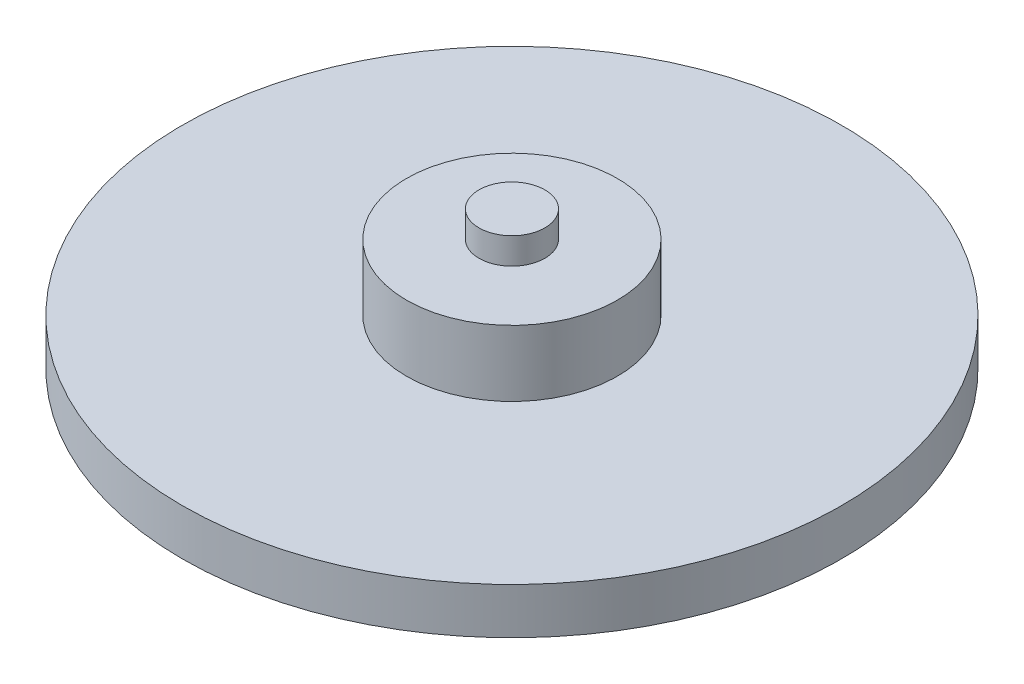
ISO-10303-21;
HEADER;
FILE_DESCRIPTION(('STEP AP214'),'2;1');
FILE_NAME('part.step','',(''),(''),'','','');
FILE_SCHEMA(('AUTOMOTIVE_DESIGN { 1 0 10303 214 1 1 1 1 }'));
ENDSEC;
DATA;
#1=APPLICATION_CONTEXT('core data for automotive mechanical design processes');
#2=APPLICATION_PROTOCOL_DEFINITION('international standard','automotive_design',2000,#1);
#3=PRODUCT_CONTEXT('',#1,'mechanical');
#4=PRODUCT('Part','Part','',(#3));
#5=PRODUCT_RELATED_PRODUCT_CATEGORY('part','',(#4));
#6=PRODUCT_DEFINITION_FORMATION('','',#4);
#7=PRODUCT_DEFINITION_CONTEXT('part definition',#1,'design');
#8=PRODUCT_DEFINITION('design','',#6,#7);
#9=PRODUCT_DEFINITION_SHAPE('','',#8);
#10=(LENGTH_UNIT() NAMED_UNIT(*) SI_UNIT(.MILLI.,.METRE.));
#11=(NAMED_UNIT(*) PLANE_ANGLE_UNIT() SI_UNIT($,.RADIAN.));
#12=(NAMED_UNIT(*) SI_UNIT($,.STERADIAN.) SOLID_ANGLE_UNIT());
#13=UNCERTAINTY_MEASURE_WITH_UNIT(LENGTH_MEASURE(1.E-05),#10,'distance_accuracy_value','');
#14=(GEOMETRIC_REPRESENTATION_CONTEXT(3) GLOBAL_UNCERTAINTY_ASSIGNED_CONTEXT((#13)) GLOBAL_UNIT_ASSIGNED_CONTEXT((#10,
#11,#12)) REPRESENTATION_CONTEXT('',''));
#15=CARTESIAN_POINT('',(0.,0.,0.));
#16=DIRECTION('',(0.,0.,1.));
#17=DIRECTION('',(1.,0.,0.));
#18=AXIS2_PLACEMENT_3D('',#15,#16,#17);
#19=CARTESIAN_POINT('',(0.,3.5,0.));
#20=DIRECTION('',(0.,-1.,0.));
#21=DIRECTION('',(0.,0.,-1.));
#22=AXIS2_PLACEMENT_3D('',#19,#20,#21);
#23=CYLINDRICAL_SURFACE('',#22,25.);
#24=CARTESIAN_POINT('',(0.,3.5,0.));
#25=DIRECTION('',(0.,1.,0.));
#26=DIRECTION('',(0.,0.,1.));
#27=AXIS2_PLACEMENT_3D('',#24,#25,#26);
#28=CIRCLE('',#27,25.);
#29=CARTESIAN_POINT('',(0.,3.5,25.));
#30=VERTEX_POINT('',#29);
#31=EDGE_CURVE('E51',#30,#30,#28,.T.);
#32=ORIENTED_EDGE('',*,*,#31,.F.);
#33=EDGE_LOOP('',(#32));
#34=FACE_BOUND('',#33,.T.);
#35=CARTESIAN_POINT('',(0.,0.,0.));
#36=DIRECTION('',(0.,1.,0.));
#37=DIRECTION('',(0.,0.,1.));
#38=AXIS2_PLACEMENT_3D('',#35,#36,#37);
#39=CIRCLE('',#38,25.);
#40=CARTESIAN_POINT('',(0.,0.,25.));
#41=VERTEX_POINT('',#40);
#42=EDGE_CURVE('E40',#41,#41,#39,.T.);
#43=ORIENTED_EDGE('',*,*,#42,.T.);
#44=EDGE_LOOP('',(#43));
#45=FACE_BOUND('',#44,.T.);
#46=ADVANCED_FACE('F37',(#34,#45),#23,.T.);
#47=CARTESIAN_POINT('',(0.,3.5,0.));
#48=DIRECTION('',(0.,1.,0.));
#49=DIRECTION('',(0.,0.,1.));
#50=AXIS2_PLACEMENT_3D('',#47,#48,#49);
#51=PLANE('',#50);
#52=CARTESIAN_POINT('',(0.,3.5,0.));
#53=DIRECTION('',(0.,1.,0.));
#54=DIRECTION('',(0.,0.,1.));
#55=AXIS2_PLACEMENT_3D('',#52,#53,#54);
#56=CIRCLE('',#55,8.);
#57=CARTESIAN_POINT('',(0.,3.5,8.));
#58=VERTEX_POINT('',#57);
#59=EDGE_CURVE('E45',#58,#58,#56,.T.);
#60=ORIENTED_EDGE('',*,*,#59,.F.);
#61=EDGE_LOOP('',(#60));
#62=FACE_BOUND('',#61,.T.);
#63=ORIENTED_EDGE('',*,*,#31,.T.);
#64=EDGE_LOOP('',(#63));
#65=FACE_BOUND('',#64,.T.);
#66=ADVANCED_FACE('F71',(#62,#65),#51,.T.);
#67=CARTESIAN_POINT('',(0.,0.,0.));
#68=DIRECTION('',(0.,1.,0.));
#69=DIRECTION('',(0.,0.,1.));
#70=AXIS2_PLACEMENT_3D('',#67,#68,#69);
#71=PLANE('',#70);
#72=ORIENTED_EDGE('',*,*,#42,.F.);
#73=EDGE_LOOP('',(#72));
#74=FACE_BOUND('',#73,.T.);
#75=ADVANCED_FACE('F68',(#74),#71,.F.);
#76=CARTESIAN_POINT('',(0.,8.5,0.));
#77=DIRECTION('',(0.,-1.,0.));
#78=DIRECTION('',(0.,0.,-1.));
#79=AXIS2_PLACEMENT_3D('',#76,#77,#78);
#80=CYLINDRICAL_SURFACE('',#79,8.);
#81=CARTESIAN_POINT('',(0.,8.5,0.));
#82=DIRECTION('',(0.,1.,0.));
#83=DIRECTION('',(0.,0.,1.));
#84=AXIS2_PLACEMENT_3D('',#81,#82,#83);
#85=CIRCLE('',#84,8.);
#86=CARTESIAN_POINT('',(0.,8.5,8.));
#87=VERTEX_POINT('',#86);
#88=EDGE_CURVE('E56',#87,#87,#85,.T.);
#89=ORIENTED_EDGE('',*,*,#88,.F.);
#90=EDGE_LOOP('',(#89));
#91=FACE_BOUND('',#90,.T.);
#92=ORIENTED_EDGE('',*,*,#59,.T.);
#93=EDGE_LOOP('',(#92));
#94=FACE_BOUND('',#93,.T.);
#95=ADVANCED_FACE('F70',(#91,#94),#80,.T.);
#96=CARTESIAN_POINT('',(0.,8.5,0.));
#97=DIRECTION('',(0.,1.,0.));
#98=DIRECTION('',(0.,0.,1.));
#99=AXIS2_PLACEMENT_3D('',#96,#97,#98);
#100=PLANE('',#99);
#101=CARTESIAN_POINT('',(0.,8.5,0.));
#102=DIRECTION('',(0.,1.,0.));
#103=DIRECTION('',(0.,0.,1.));
#104=AXIS2_PLACEMENT_3D('',#101,#102,#103);
#105=CIRCLE('',#104,2.5);
#106=CARTESIAN_POINT('',(0.,8.5,2.5));
#107=VERTEX_POINT('',#106);
#108=EDGE_CURVE('E10',#107,#107,#105,.T.);
#109=ORIENTED_EDGE('',*,*,#108,.F.);
#110=EDGE_LOOP('',(#109));
#111=FACE_BOUND('',#110,.T.);
#112=ORIENTED_EDGE('',*,*,#88,.T.);
#113=EDGE_LOOP('',(#112));
#114=FACE_BOUND('',#113,.T.);
#115=ADVANCED_FACE('F76',(#111,#114),#100,.T.);
#116=CARTESIAN_POINT('',(0.,10.5,0.));
#117=DIRECTION('',(0.,-1.,0.));
#118=DIRECTION('',(0.,0.,-1.));
#119=AXIS2_PLACEMENT_3D('',#116,#117,#118);
#120=CYLINDRICAL_SURFACE('',#119,2.5);
#121=CARTESIAN_POINT('',(0.,10.5,0.));
#122=DIRECTION('',(0.,1.,0.));
#123=DIRECTION('',(0.,0.,1.));
#124=AXIS2_PLACEMENT_3D('',#121,#122,#123);
#125=CIRCLE('',#124,2.5);
#126=CARTESIAN_POINT('',(0.,10.5,2.5));
#127=VERTEX_POINT('',#126);
#128=EDGE_CURVE('E55',#127,#127,#125,.T.);
#129=ORIENTED_EDGE('',*,*,#128,.F.);
#130=EDGE_LOOP('',(#129));
#131=FACE_BOUND('',#130,.T.);
#132=ORIENTED_EDGE('',*,*,#108,.T.);
#133=EDGE_LOOP('',(#132));
#134=FACE_BOUND('',#133,.T.);
#135=ADVANCED_FACE('F106',(#131,#134),#120,.T.);
#136=CARTESIAN_POINT('',(0.,10.5,0.));
#137=DIRECTION('',(0.,1.,0.));
#138=DIRECTION('',(0.,0.,1.));
#139=AXIS2_PLACEMENT_3D('',#136,#137,#138);
#140=PLANE('',#139);
#141=ORIENTED_EDGE('',*,*,#128,.T.);
#142=EDGE_LOOP('',(#141));
#143=FACE_BOUND('',#142,.T.);
#144=ADVANCED_FACE('F116',(#143),#140,.T.);
#145=CLOSED_SHELL('',(#46,#66,#75,#95,#115,#135,#144));
#146=MANIFOLD_SOLID_BREP('B2',#145);
#147=ADVANCED_BREP_SHAPE_REPRESENTATION('',(#18,#146),#14);
#148=SHAPE_DEFINITION_REPRESENTATION(#9,#147);
ENDSEC;
END-ISO-10303-21;
